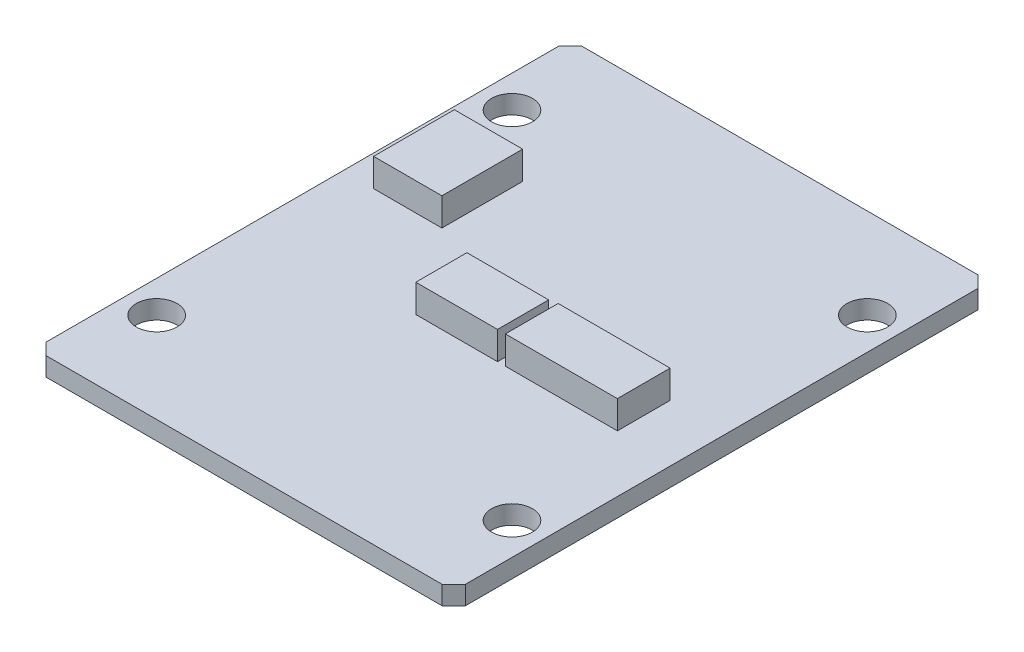
ISO-10303-21;
HEADER;
FILE_DESCRIPTION(('STEP AP214'),'2;1');
FILE_NAME('part.step','',(''),(''),'','','');
FILE_SCHEMA(('AUTOMOTIVE_DESIGN { 1 0 10303 214 1 1 1 1 }'));
ENDSEC;
DATA;
#1=APPLICATION_CONTEXT('core data for automotive mechanical design processes');
#2=APPLICATION_PROTOCOL_DEFINITION('international standard','automotive_design',2000,#1);
#3=PRODUCT_CONTEXT('',#1,'mechanical');
#4=PRODUCT('Part','Part','',(#3));
#5=PRODUCT_RELATED_PRODUCT_CATEGORY('part','',(#4));
#6=PRODUCT_DEFINITION_FORMATION('','',#4);
#7=PRODUCT_DEFINITION_CONTEXT('part definition',#1,'design');
#8=PRODUCT_DEFINITION('design','',#6,#7);
#9=PRODUCT_DEFINITION_SHAPE('','',#8);
#10=(LENGTH_UNIT() NAMED_UNIT(*) SI_UNIT(.MILLI.,.METRE.));
#11=(NAMED_UNIT(*) PLANE_ANGLE_UNIT() SI_UNIT($,.RADIAN.));
#12=(NAMED_UNIT(*) SI_UNIT($,.STERADIAN.) SOLID_ANGLE_UNIT());
#13=UNCERTAINTY_MEASURE_WITH_UNIT(LENGTH_MEASURE(1.E-05),#10,'distance_accuracy_value','');
#14=(GEOMETRIC_REPRESENTATION_CONTEXT(3) GLOBAL_UNCERTAINTY_ASSIGNED_CONTEXT((#13)) GLOBAL_UNIT_ASSIGNED_CONTEXT((#10,
#11,#12)) REPRESENTATION_CONTEXT('',''));
#15=CARTESIAN_POINT('',(0.,0.,0.));
#16=DIRECTION('',(0.,0.,1.));
#17=DIRECTION('',(1.,0.,0.));
#18=AXIS2_PLACEMENT_3D('',#15,#16,#17);
#19=CARTESIAN_POINT('',(-18.,1.6,0.));
#20=DIRECTION('',(1.,0.,0.));
#21=DIRECTION('',(0.,0.,-1.));
#22=AXIS2_PLACEMENT_3D('',#19,#20,#21);
#23=PLANE('',#22);
#24=DIRECTION('',(0.,0.,1.));
#25=VECTOR('',#24,1.);
#26=CARTESIAN_POINT('',(-18.,0.,0.));
#27=LINE('',#26,#25);
#28=CARTESIAN_POINT('',(-18.,0.,-22.));
#29=VERTEX_POINT('',#28);
#30=CARTESIAN_POINT('',(-18.,0.,22.));
#31=VERTEX_POINT('',#30);
#32=EDGE_CURVE('E270',#29,#31,#27,.T.);
#33=ORIENTED_EDGE('',*,*,#32,.T.);
#34=DIRECTION('',(0.,1.,0.));
#35=VECTOR('',#34,1.);
#36=CARTESIAN_POINT('',(-18.,1.6,22.));
#37=LINE('',#36,#35);
#38=CARTESIAN_POINT('',(-18.,1.6,22.));
#39=VERTEX_POINT('',#38);
#40=EDGE_CURVE('E350',#31,#39,#37,.T.);
#41=ORIENTED_EDGE('',*,*,#40,.T.);
#42=DIRECTION('',(0.,0.,1.));
#43=VECTOR('',#42,1.);
#44=CARTESIAN_POINT('',(-18.,1.6,0.));
#45=LINE('',#44,#43);
#46=CARTESIAN_POINT('',(-18.,1.6,-22.));
#47=VERTEX_POINT('',#46);
#48=EDGE_CURVE('E276',#47,#39,#45,.T.);
#49=ORIENTED_EDGE('',*,*,#48,.F.);
#50=DIRECTION('',(0.,-1.,0.));
#51=VECTOR('',#50,1.);
#52=CARTESIAN_POINT('',(-18.,0.,-22.));
#53=LINE('',#52,#51);
#54=EDGE_CURVE('E347',#47,#29,#53,.T.);
#55=ORIENTED_EDGE('',*,*,#54,.T.);
#56=EDGE_LOOP('',(#33,#41,#49,#55));
#57=FACE_BOUND('',#56,.T.);
#58=ADVANCED_FACE('F38',(#57),#23,.F.);
#59=CARTESIAN_POINT('',(0.,1.6,23.));
#60=DIRECTION('',(0.,0.,-1.));
#61=DIRECTION('',(-1.,0.,0.));
#62=AXIS2_PLACEMENT_3D('',#59,#60,#61);
#63=PLANE('',#62);
#64=DIRECTION('',(1.,0.,0.));
#65=VECTOR('',#64,1.);
#66=CARTESIAN_POINT('',(0.,0.,23.));
#67=LINE('',#66,#65);
#68=CARTESIAN_POINT('',(-17.,0.,23.));
#69=VERTEX_POINT('',#68);
#70=CARTESIAN_POINT('',(17.,0.,23.));
#71=VERTEX_POINT('',#70);
#72=EDGE_CURVE('E303',#69,#71,#67,.T.);
#73=ORIENTED_EDGE('',*,*,#72,.T.);
#74=DIRECTION('',(0.,1.,0.));
#75=VECTOR('',#74,1.);
#76=CARTESIAN_POINT('',(17.,1.6,23.));
#77=LINE('',#76,#75);
#78=CARTESIAN_POINT('',(17.,1.6,23.));
#79=VERTEX_POINT('',#78);
#80=EDGE_CURVE('E338',#71,#79,#77,.T.);
#81=ORIENTED_EDGE('',*,*,#80,.T.);
#82=DIRECTION('',(1.,0.,0.));
#83=VECTOR('',#82,1.);
#84=CARTESIAN_POINT('',(0.,1.6,23.));
#85=LINE('',#84,#83);
#86=CARTESIAN_POINT('',(-17.,1.6,23.));
#87=VERTEX_POINT('',#86);
#88=EDGE_CURVE('E279',#87,#79,#85,.T.);
#89=ORIENTED_EDGE('',*,*,#88,.F.);
#90=DIRECTION('',(0.,-1.,0.));
#91=VECTOR('',#90,1.);
#92=CARTESIAN_POINT('',(-17.,1.6,23.));
#93=LINE('',#92,#91);
#94=EDGE_CURVE('E335',#87,#69,#93,.T.);
#95=ORIENTED_EDGE('',*,*,#94,.T.);
#96=EDGE_LOOP('',(#73,#81,#89,#95));
#97=FACE_BOUND('',#96,.T.);
#98=ADVANCED_FACE('F376',(#97),#63,.F.);
#99=CARTESIAN_POINT('',(18.,1.6,0.));
#100=DIRECTION('',(1.,0.,0.));
#101=DIRECTION('',(0.,0.,-1.));
#102=AXIS2_PLACEMENT_3D('',#99,#100,#101);
#103=PLANE('',#102);
#104=DIRECTION('',(0.,0.,1.));
#105=VECTOR('',#104,1.);
#106=CARTESIAN_POINT('',(18.,1.6,0.));
#107=LINE('',#106,#105);
#108=CARTESIAN_POINT('',(18.,1.6,-22.));
#109=VERTEX_POINT('',#108);
#110=CARTESIAN_POINT('',(18.,1.6,22.));
#111=VERTEX_POINT('',#110);
#112=EDGE_CURVE('E283',#109,#111,#107,.T.);
#113=ORIENTED_EDGE('',*,*,#112,.T.);
#114=DIRECTION('',(0.,-1.,0.));
#115=VECTOR('',#114,1.);
#116=CARTESIAN_POINT('',(18.,0.,22.));
#117=LINE('',#116,#115);
#118=CARTESIAN_POINT('',(18.,0.,22.));
#119=VERTEX_POINT('',#118);
#120=EDGE_CURVE('E324',#111,#119,#117,.T.);
#121=ORIENTED_EDGE('',*,*,#120,.T.);
#122=DIRECTION('',(0.,0.,1.));
#123=VECTOR('',#122,1.);
#124=CARTESIAN_POINT('',(18.,0.,0.));
#125=LINE('',#124,#123);
#126=CARTESIAN_POINT('',(18.,0.,-22.));
#127=VERTEX_POINT('',#126);
#128=EDGE_CURVE('E306',#127,#119,#125,.T.);
#129=ORIENTED_EDGE('',*,*,#128,.F.);
#130=DIRECTION('',(0.,1.,0.));
#131=VECTOR('',#130,1.);
#132=CARTESIAN_POINT('',(18.,1.6,-22.));
#133=LINE('',#132,#131);
#134=EDGE_CURVE('E300',#127,#109,#133,.T.);
#135=ORIENTED_EDGE('',*,*,#134,.T.);
#136=EDGE_LOOP('',(#113,#121,#129,#135));
#137=FACE_BOUND('',#136,.T.);
#138=ADVANCED_FACE('F383',(#137),#103,.T.);
#139=CARTESIAN_POINT('',(-15.25,1.6,-15.25));
#140=DIRECTION('',(0.,-1.,0.));
#141=DIRECTION('',(0.,0.,-1.));
#142=AXIS2_PLACEMENT_3D('',#139,#140,#141);
#143=CYLINDRICAL_SURFACE('',#142,1.75);
#144=CARTESIAN_POINT('',(-15.25,1.6,-15.25));
#145=DIRECTION('',(0.,1.,0.));
#146=DIRECTION('',(0.,0.,1.));
#147=AXIS2_PLACEMENT_3D('',#144,#145,#146);
#148=CIRCLE('',#147,1.75);
#149=CARTESIAN_POINT('',(-15.25,1.6,-13.5));
#150=VERTEX_POINT('',#149);
#151=EDGE_CURVE('E294',#150,#150,#148,.T.);
#152=ORIENTED_EDGE('',*,*,#151,.T.);
#153=EDGE_LOOP('',(#152));
#154=FACE_BOUND('',#153,.T.);
#155=CARTESIAN_POINT('',(-15.25,0.,-15.25));
#156=DIRECTION('',(0.,1.,0.));
#157=DIRECTION('',(0.,0.,1.));
#158=AXIS2_PLACEMENT_3D('',#155,#156,#157);
#159=CIRCLE('',#158,1.75);
#160=CARTESIAN_POINT('',(-15.25,0.,-13.5));
#161=VERTEX_POINT('',#160);
#162=EDGE_CURVE('E318',#161,#161,#159,.T.);
#163=ORIENTED_EDGE('',*,*,#162,.F.);
#164=EDGE_LOOP('',(#163));
#165=FACE_BOUND('',#164,.T.);
#166=ADVANCED_FACE('F595',(#154,#165),#143,.F.);
#167=CARTESIAN_POINT('',(15.25,1.6,-15.25));
#168=DIRECTION('',(0.,-1.,0.));
#169=DIRECTION('',(0.,0.,-1.));
#170=AXIS2_PLACEMENT_3D('',#167,#168,#169);
#171=CYLINDRICAL_SURFACE('',#170,1.75);
#172=CARTESIAN_POINT('',(15.25,1.6,-15.25));
#173=DIRECTION('',(0.,1.,0.));
#174=DIRECTION('',(0.,0.,1.));
#175=AXIS2_PLACEMENT_3D('',#172,#173,#174);
#176=CIRCLE('',#175,1.75);
#177=CARTESIAN_POINT('',(15.25,1.6,-13.5));
#178=VERTEX_POINT('',#177);
#179=EDGE_CURVE('E291',#178,#178,#176,.F.);
#180=ORIENTED_EDGE('',*,*,#179,.F.);
#181=EDGE_LOOP('',(#180));
#182=FACE_BOUND('',#181,.T.);
#183=CARTESIAN_POINT('',(15.25,0.,-15.25));
#184=DIRECTION('',(0.,1.,0.));
#185=DIRECTION('',(0.,0.,1.));
#186=AXIS2_PLACEMENT_3D('',#183,#184,#185);
#187=CIRCLE('',#186,1.75);
#188=CARTESIAN_POINT('',(15.25,0.,-13.5));
#189=VERTEX_POINT('',#188);
#190=EDGE_CURVE('E315',#189,#189,#187,.F.);
#191=ORIENTED_EDGE('',*,*,#190,.T.);
#192=EDGE_LOOP('',(#191));
#193=FACE_BOUND('',#192,.T.);
#194=ADVANCED_FACE('F619',(#182,#193),#171,.F.);
#195=CARTESIAN_POINT('',(15.25,1.6,15.25));
#196=DIRECTION('',(0.,-1.,0.));
#197=DIRECTION('',(0.,0.,-1.));
#198=AXIS2_PLACEMENT_3D('',#195,#196,#197);
#199=CYLINDRICAL_SURFACE('',#198,1.75);
#200=CARTESIAN_POINT('',(15.25,1.6,15.25));
#201=DIRECTION('',(0.,1.,0.));
#202=DIRECTION('',(0.,0.,1.));
#203=AXIS2_PLACEMENT_3D('',#200,#201,#202);
#204=CIRCLE('',#203,1.75);
#205=CARTESIAN_POINT('',(15.25,1.6,17.));
#206=VERTEX_POINT('',#205);
#207=EDGE_CURVE('E288',#206,#206,#204,.T.);
#208=ORIENTED_EDGE('',*,*,#207,.T.);
#209=EDGE_LOOP('',(#208));
#210=FACE_BOUND('',#209,.T.);
#211=CARTESIAN_POINT('',(15.25,0.,15.25));
#212=DIRECTION('',(0.,1.,0.));
#213=DIRECTION('',(0.,0.,1.));
#214=AXIS2_PLACEMENT_3D('',#211,#212,#213);
#215=CIRCLE('',#214,1.75);
#216=CARTESIAN_POINT('',(15.25,0.,17.));
#217=VERTEX_POINT('',#216);
#218=EDGE_CURVE('E312',#217,#217,#215,.T.);
#219=ORIENTED_EDGE('',*,*,#218,.F.);
#220=EDGE_LOOP('',(#219));
#221=FACE_BOUND('',#220,.T.);
#222=ADVANCED_FACE('F582',(#210,#221),#199,.F.);
#223=CARTESIAN_POINT('',(0.,1.6,-23.));
#224=DIRECTION('',(0.,0.,-1.));
#225=DIRECTION('',(-1.,0.,0.));
#226=AXIS2_PLACEMENT_3D('',#223,#224,#225);
#227=PLANE('',#226);
#228=DIRECTION('',(1.,0.,0.));
#229=VECTOR('',#228,1.);
#230=CARTESIAN_POINT('',(0.,0.,-23.));
#231=LINE('',#230,#229);
#232=CARTESIAN_POINT('',(-17.,0.,-23.));
#233=VERTEX_POINT('',#232);
#234=CARTESIAN_POINT('',(17.,0.,-23.));
#235=VERTEX_POINT('',#234);
#236=EDGE_CURVE('E309',#233,#235,#231,.T.);
#237=ORIENTED_EDGE('',*,*,#236,.F.);
#238=DIRECTION('',(0.,1.,0.));
#239=VECTOR('',#238,1.);
#240=CARTESIAN_POINT('',(-17.,1.6,-23.));
#241=LINE('',#240,#239);
#242=CARTESIAN_POINT('',(-17.,1.6,-23.));
#243=VERTEX_POINT('',#242);
#244=EDGE_CURVE('E12',#233,#243,#241,.T.);
#245=ORIENTED_EDGE('',*,*,#244,.T.);
#246=DIRECTION('',(1.,0.,0.));
#247=VECTOR('',#246,1.);
#248=CARTESIAN_POINT('',(0.,1.6,-23.));
#249=LINE('',#248,#247);
#250=CARTESIAN_POINT('',(17.,1.6,-23.));
#251=VERTEX_POINT('',#250);
#252=EDGE_CURVE('E286',#243,#251,#249,.T.);
#253=ORIENTED_EDGE('',*,*,#252,.T.);
#254=DIRECTION('',(0.,-1.,0.));
#255=VECTOR('',#254,1.);
#256=CARTESIAN_POINT('',(17.,1.6,-23.));
#257=LINE('',#256,#255);
#258=EDGE_CURVE('E46',#251,#235,#257,.T.);
#259=ORIENTED_EDGE('',*,*,#258,.T.);
#260=EDGE_LOOP('',(#237,#245,#253,#259));
#261=FACE_BOUND('',#260,.T.);
#262=ADVANCED_FACE('F353',(#261),#227,.T.);
#263=CARTESIAN_POINT('',(-15.25,1.6,15.25));
#264=DIRECTION('',(0.,-1.,0.));
#265=DIRECTION('',(0.,0.,-1.));
#266=AXIS2_PLACEMENT_3D('',#263,#264,#265);
#267=CYLINDRICAL_SURFACE('',#266,1.75);
#268=CARTESIAN_POINT('',(-15.25,1.6,15.25));
#269=DIRECTION('',(0.,1.,0.));
#270=DIRECTION('',(0.,0.,1.));
#271=AXIS2_PLACEMENT_3D('',#268,#269,#270);
#272=CIRCLE('',#271,1.75);
#273=CARTESIAN_POINT('',(-15.25,1.6,17.));
#274=VERTEX_POINT('',#273);
#275=EDGE_CURVE('E297',#274,#274,#272,.F.);
#276=ORIENTED_EDGE('',*,*,#275,.F.);
#277=EDGE_LOOP('',(#276));
#278=FACE_BOUND('',#277,.T.);
#279=CARTESIAN_POINT('',(-15.25,0.,15.25));
#280=DIRECTION('',(0.,1.,0.));
#281=DIRECTION('',(0.,0.,1.));
#282=AXIS2_PLACEMENT_3D('',#279,#280,#281);
#283=CIRCLE('',#282,1.75);
#284=CARTESIAN_POINT('',(-15.25,0.,17.));
#285=VERTEX_POINT('',#284);
#286=EDGE_CURVE('E280',#285,#285,#283,.F.);
#287=ORIENTED_EDGE('',*,*,#286,.T.);
#288=EDGE_LOOP('',(#287));
#289=FACE_BOUND('',#288,.T.);
#290=ADVANCED_FACE('F571',(#278,#289),#267,.F.);
#291=CARTESIAN_POINT('',(0.,1.6,0.));
#292=DIRECTION('',(0.,1.,0.));
#293=DIRECTION('',(0.,0.,1.));
#294=AXIS2_PLACEMENT_3D('',#291,#292,#293);
#295=PLANE('',#294);
#296=DIRECTION('',(0.,0.,1.));
#297=VECTOR('',#296,1.);
#298=CARTESIAN_POINT('',(13.1179567969752,1.6,0.));
#299=LINE('',#298,#297);
#300=CARTESIAN_POINT('',(13.1179567969752,1.6,-0.456616261899967));
#301=VERTEX_POINT('',#300);
#302=CARTESIAN_POINT('',(13.1179567969752,1.6,4.07409624601484));
#303=VERTEX_POINT('',#302);
#304=EDGE_CURVE('E199',#301,#303,#299,.T.);
#305=ORIENTED_EDGE('',*,*,#304,.T.);
#306=DIRECTION('',(-1.,0.,0.));
#307=VECTOR('',#306,1.);
#308=CARTESIAN_POINT('',(0.,1.6,4.07409624601485));
#309=LINE('',#308,#307);
#310=CARTESIAN_POINT('',(3.50408128491608,1.6,4.07409624601485));
#311=VERTEX_POINT('',#310);
#312=EDGE_CURVE('E190',#303,#311,#309,.T.);
#313=ORIENTED_EDGE('',*,*,#312,.T.);
#314=DIRECTION('',(0.,0.,1.));
#315=VECTOR('',#314,1.);
#316=CARTESIAN_POINT('',(3.50408128491608,1.6,0.));
#317=LINE('',#316,#315);
#318=CARTESIAN_POINT('',(3.50408128491608,1.6,-0.456616261899966));
#319=VERTEX_POINT('',#318);
#320=EDGE_CURVE('E210',#319,#311,#317,.T.);
#321=ORIENTED_EDGE('',*,*,#320,.F.);
#322=DIRECTION('',(-1.,0.,0.));
#323=VECTOR('',#322,1.);
#324=CARTESIAN_POINT('',(0.,1.6,-0.456616261899965));
#325=LINE('',#324,#323);
#326=EDGE_CURVE('E203',#301,#319,#325,.T.);
#327=ORIENTED_EDGE('',*,*,#326,.F.);
#328=EDGE_LOOP('',(#305,#313,#321,#327));
#329=FACE_BOUND('',#328,.T.);
#330=DIRECTION('',(0.,0.,1.));
#331=VECTOR('',#330,1.);
#332=CARTESIAN_POINT('',(2.83132891269133,1.6,0.));
#333=LINE('',#332,#331);
#334=CARTESIAN_POINT('',(2.83132891269133,1.6,-0.315445177790253));
#335=VERTEX_POINT('',#334);
#336=CARTESIAN_POINT('',(2.83132891269133,1.6,4.07409624601485));
#337=VERTEX_POINT('',#336);
#338=EDGE_CURVE('E213',#335,#337,#333,.T.);
#339=ORIENTED_EDGE('',*,*,#338,.T.);
#340=DIRECTION('',(-1.,0.,0.));
#341=VECTOR('',#340,1.);
#342=CARTESIAN_POINT('',(0.,1.6,4.07409624601485));
#343=LINE('',#342,#341);
#344=CARTESIAN_POINT('',(-4.18474470458818,1.6,4.07409624601485));
#345=VERTEX_POINT('',#344);
#346=EDGE_CURVE('E216',#337,#345,#343,.T.);
#347=ORIENTED_EDGE('',*,*,#346,.T.);
#348=DIRECTION('',(0.,0.,1.));
#349=VECTOR('',#348,1.);
#350=CARTESIAN_POINT('',(-4.18474470458818,1.6,0.));
#351=LINE('',#350,#349);
#352=CARTESIAN_POINT('',(-4.18474470458818,1.6,-0.315445177790252));
#353=VERTEX_POINT('',#352);
#354=EDGE_CURVE('E221',#353,#345,#351,.T.);
#355=ORIENTED_EDGE('',*,*,#354,.F.);
#356=DIRECTION('',(-1.,0.,0.));
#357=VECTOR('',#356,1.);
#358=CARTESIAN_POINT('',(0.,1.6,-0.315445177790253));
#359=LINE('',#358,#357);
#360=EDGE_CURVE('E226',#335,#353,#359,.T.);
#361=ORIENTED_EDGE('',*,*,#360,.F.);
#362=EDGE_LOOP('',(#339,#347,#355,#361));
#363=FACE_BOUND('',#362,.T.);
#364=DIRECTION('',(0.,0.,1.));
#365=VECTOR('',#364,1.);
#366=CARTESIAN_POINT('',(-9.49091762336707,1.6,0.));
#367=LINE('',#366,#365);
#368=CARTESIAN_POINT('',(-9.49091762336707,1.6,-10.4053504783934));
#369=VERTEX_POINT('',#368);
#370=CARTESIAN_POINT('',(-9.49091762336707,1.6,-3.47196775484804));
#371=VERTEX_POINT('',#370);
#372=EDGE_CURVE('E248',#369,#371,#367,.T.);
#373=ORIENTED_EDGE('',*,*,#372,.T.);
#374=DIRECTION('',(1.,0.,0.));
#375=VECTOR('',#374,1.);
#376=CARTESIAN_POINT('',(0.,1.6,-3.47196775484804));
#377=LINE('',#376,#375);
#378=CARTESIAN_POINT('',(-15.35478813841,1.6,-3.47196775484804));
#379=VERTEX_POINT('',#378);
#380=EDGE_CURVE('E245',#379,#371,#377,.T.);
#381=ORIENTED_EDGE('',*,*,#380,.F.);
#382=DIRECTION('',(0.,0.,1.));
#383=VECTOR('',#382,1.);
#384=CARTESIAN_POINT('',(-15.35478813841,1.6,0.));
#385=LINE('',#384,#383);
#386=CARTESIAN_POINT('',(-15.35478813841,1.6,-10.4053504783934));
#387=VERTEX_POINT('',#386);
#388=EDGE_CURVE('E250',#387,#379,#385,.T.);
#389=ORIENTED_EDGE('',*,*,#388,.F.);
#390=DIRECTION('',(1.,0.,0.));
#391=VECTOR('',#390,1.);
#392=CARTESIAN_POINT('',(0.,1.6,-10.4053504783934));
#393=LINE('',#392,#391);
#394=EDGE_CURVE('E253',#387,#369,#393,.T.);
#395=ORIENTED_EDGE('',*,*,#394,.T.);
#396=EDGE_LOOP('',(#373,#381,#389,#395));
#397=FACE_BOUND('',#396,.T.);
#398=ORIENTED_EDGE('',*,*,#88,.T.);
#399=DIRECTION('',(0.70710678118655,0.,-0.707106781186545));
#400=VECTOR('',#399,1.);
#401=CARTESIAN_POINT('',(19.9999999999999,1.6,20.0000000000001));
#402=LINE('',#401,#400);
#403=EDGE_CURVE('E345',#79,#111,#402,.T.);
#404=ORIENTED_EDGE('',*,*,#403,.T.);
#405=ORIENTED_EDGE('',*,*,#112,.F.);
#406=DIRECTION('',(0.707106781186545,0.,0.70710678118655));
#407=VECTOR('',#406,1.);
#408=CARTESIAN_POINT('',(20.0000000000001,1.6,-19.9999999999999));
#409=LINE('',#408,#407);
#410=EDGE_CURVE('E53',#109,#251,#409,.F.);
#411=ORIENTED_EDGE('',*,*,#410,.T.);
#412=ORIENTED_EDGE('',*,*,#252,.F.);
#413=DIRECTION('',(-0.70710678118655,0.,0.707106781186545));
#414=VECTOR('',#413,1.);
#415=CARTESIAN_POINT('',(-19.9999999999999,1.6,-20.0000000000001));
#416=LINE('',#415,#414);
#417=EDGE_CURVE('E341',#243,#47,#416,.T.);
#418=ORIENTED_EDGE('',*,*,#417,.T.);
#419=ORIENTED_EDGE('',*,*,#48,.T.);
#420=DIRECTION('',(-0.707106781186545,0.,-0.70710678118655));
#421=VECTOR('',#420,1.);
#422=CARTESIAN_POINT('',(-20.0000000000001,1.6,19.9999999999999));
#423=LINE('',#422,#421);
#424=EDGE_CURVE('E343',#39,#87,#423,.F.);
#425=ORIENTED_EDGE('',*,*,#424,.T.);
#426=EDGE_LOOP('',(#398,#404,#405,#411,#412,#418,#419,#425));
#427=FACE_BOUND('',#426,.T.);
#428=ORIENTED_EDGE('',*,*,#207,.F.);
#429=EDGE_LOOP('',(#428));
#430=FACE_BOUND('',#429,.T.);
#431=ORIENTED_EDGE('',*,*,#179,.T.);
#432=EDGE_LOOP('',(#431));
#433=FACE_BOUND('',#432,.T.);
#434=ORIENTED_EDGE('',*,*,#151,.F.);
#435=EDGE_LOOP('',(#434));
#436=FACE_BOUND('',#435,.T.);
#437=ORIENTED_EDGE('',*,*,#275,.T.);
#438=EDGE_LOOP('',(#437));
#439=FACE_BOUND('',#438,.T.);
#440=ADVANCED_FACE('F368',(#329,#363,#397,#427,#430,#433,#436,#439),#295,.T.);
#441=CARTESIAN_POINT('',(0.,0.,0.));
#442=DIRECTION('',(0.,1.,0.));
#443=DIRECTION('',(0.,0.,1.));
#444=AXIS2_PLACEMENT_3D('',#441,#442,#443);
#445=PLANE('',#444);
#446=ORIENTED_EDGE('',*,*,#128,.T.);
#447=DIRECTION('',(-0.70710678118655,0.,0.707106781186545));
#448=VECTOR('',#447,1.);
#449=CARTESIAN_POINT('',(18.,0.,22.));
#450=LINE('',#449,#448);
#451=EDGE_CURVE('E333',#119,#71,#450,.T.);
#452=ORIENTED_EDGE('',*,*,#451,.T.);
#453=ORIENTED_EDGE('',*,*,#72,.F.);
#454=DIRECTION('',(0.707106781186545,0.,0.70710678118655));
#455=VECTOR('',#454,1.);
#456=CARTESIAN_POINT('',(-17.,0.,23.));
#457=LINE('',#456,#455);
#458=EDGE_CURVE('E331',#69,#31,#457,.F.);
#459=ORIENTED_EDGE('',*,*,#458,.T.);
#460=ORIENTED_EDGE('',*,*,#32,.F.);
#461=DIRECTION('',(0.70710678118655,0.,-0.707106781186545));
#462=VECTOR('',#461,1.);
#463=CARTESIAN_POINT('',(-18.,0.,-22.));
#464=LINE('',#463,#462);
#465=EDGE_CURVE('E329',#29,#233,#464,.T.);
#466=ORIENTED_EDGE('',*,*,#465,.T.);
#467=ORIENTED_EDGE('',*,*,#236,.T.);
#468=DIRECTION('',(-0.707106781186545,0.,-0.70710678118655));
#469=VECTOR('',#468,1.);
#470=CARTESIAN_POINT('',(17.,0.,-23.));
#471=LINE('',#470,#469);
#472=EDGE_CURVE('E327',#235,#127,#471,.F.);
#473=ORIENTED_EDGE('',*,*,#472,.T.);
#474=EDGE_LOOP('',(#446,#452,#453,#459,#460,#466,#467,#473));
#475=FACE_BOUND('',#474,.T.);
#476=ORIENTED_EDGE('',*,*,#218,.T.);
#477=EDGE_LOOP('',(#476));
#478=FACE_BOUND('',#477,.T.);
#479=ORIENTED_EDGE('',*,*,#190,.F.);
#480=EDGE_LOOP('',(#479));
#481=FACE_BOUND('',#480,.T.);
#482=ORIENTED_EDGE('',*,*,#162,.T.);
#483=EDGE_LOOP('',(#482));
#484=FACE_BOUND('',#483,.T.);
#485=ORIENTED_EDGE('',*,*,#286,.F.);
#486=EDGE_LOOP('',(#485));
#487=FACE_BOUND('',#486,.T.);
#488=ADVANCED_FACE('F356',(#475,#478,#481,#484,#487),#445,.F.);
#489=CARTESIAN_POINT('',(-9.49091762336707,18.6279799675548,0.));
#490=DIRECTION('',(1.,0.,0.));
#491=DIRECTION('',(0.,0.,-1.));
#492=AXIS2_PLACEMENT_3D('',#489,#490,#491);
#493=PLANE('',#492);
#494=DIRECTION('',(0.,-1.,0.));
#495=VECTOR('',#494,1.);
#496=CARTESIAN_POINT('',(-9.49091762336707,18.6279799675548,-10.4053504783934));
#497=LINE('',#496,#495);
#498=CARTESIAN_POINT('',(-9.49091762336707,4.,-10.4053504783934));
#499=VERTEX_POINT('',#498);
#500=EDGE_CURVE('E264',#499,#369,#497,.T.);
#501=ORIENTED_EDGE('',*,*,#500,.F.);
#502=DIRECTION('',(0.,0.,1.));
#503=VECTOR('',#502,1.);
#504=CARTESIAN_POINT('',(-9.49091762336707,4.,0.));
#505=LINE('',#504,#503);
#506=CARTESIAN_POINT('',(-9.49091762336707,4.,-3.47196775484804));
#507=VERTEX_POINT('',#506);
#508=EDGE_CURVE('E229',#499,#507,#505,.T.);
#509=ORIENTED_EDGE('',*,*,#508,.T.);
#510=DIRECTION('',(0.,-1.,0.));
#511=VECTOR('',#510,1.);
#512=CARTESIAN_POINT('',(-9.49091762336707,18.6279799675548,-3.47196775484804));
#513=LINE('',#512,#511);
#514=EDGE_CURVE('E265',#507,#371,#513,.T.);
#515=ORIENTED_EDGE('',*,*,#514,.T.);
#516=ORIENTED_EDGE('',*,*,#372,.F.);
#517=EDGE_LOOP('',(#501,#509,#515,#516));
#518=FACE_BOUND('',#517,.T.);
#519=ADVANCED_FACE('F541',(#518),#493,.T.);
#520=CARTESIAN_POINT('',(0.,18.6279799675548,-10.4053504783934));
#521=DIRECTION('',(0.,0.,-1.));
#522=DIRECTION('',(-1.,0.,0.));
#523=AXIS2_PLACEMENT_3D('',#520,#521,#522);
#524=PLANE('',#523);
#525=DIRECTION('',(0.,-1.,0.));
#526=VECTOR('',#525,1.);
#527=CARTESIAN_POINT('',(-15.35478813841,18.6279799675548,-10.4053504783934));
#528=LINE('',#527,#526);
#529=CARTESIAN_POINT('',(-15.35478813841,4.,-10.4053504783934));
#530=VERTEX_POINT('',#529);
#531=EDGE_CURVE('E252',#530,#387,#528,.T.);
#532=ORIENTED_EDGE('',*,*,#531,.F.);
#533=DIRECTION('',(1.,0.,0.));
#534=VECTOR('',#533,1.);
#535=CARTESIAN_POINT('',(0.,4.,-10.4053504783934));
#536=LINE('',#535,#534);
#537=EDGE_CURVE('E262',#530,#499,#536,.T.);
#538=ORIENTED_EDGE('',*,*,#537,.T.);
#539=ORIENTED_EDGE('',*,*,#500,.T.);
#540=ORIENTED_EDGE('',*,*,#394,.F.);
#541=EDGE_LOOP('',(#532,#538,#539,#540));
#542=FACE_BOUND('',#541,.T.);
#543=ADVANCED_FACE('F532',(#542),#524,.T.);
#544=CARTESIAN_POINT('',(-15.35478813841,18.6279799675548,0.));
#545=DIRECTION('',(1.,0.,0.));
#546=DIRECTION('',(0.,0.,-1.));
#547=AXIS2_PLACEMENT_3D('',#544,#545,#546);
#548=PLANE('',#547);
#549=DIRECTION('',(0.,0.,1.));
#550=VECTOR('',#549,1.);
#551=CARTESIAN_POINT('',(-15.35478813841,4.,0.));
#552=LINE('',#551,#550);
#553=CARTESIAN_POINT('',(-15.35478813841,4.,-3.47196775484804));
#554=VERTEX_POINT('',#553);
#555=EDGE_CURVE('E256',#530,#554,#552,.T.);
#556=ORIENTED_EDGE('',*,*,#555,.F.);
#557=ORIENTED_EDGE('',*,*,#531,.T.);
#558=ORIENTED_EDGE('',*,*,#388,.T.);
#559=DIRECTION('',(0.,-1.,0.));
#560=VECTOR('',#559,1.);
#561=CARTESIAN_POINT('',(-15.35478813841,18.6279799675548,-3.47196775484804));
#562=LINE('',#561,#560);
#563=EDGE_CURVE('E249',#554,#379,#562,.T.);
#564=ORIENTED_EDGE('',*,*,#563,.F.);
#565=EDGE_LOOP('',(#556,#557,#558,#564));
#566=FACE_BOUND('',#565,.T.);
#567=ADVANCED_FACE('F523',(#566),#548,.F.);
#568=CARTESIAN_POINT('',(0.,18.6279799675548,-3.47196775484804));
#569=DIRECTION('',(0.,0.,-1.));
#570=DIRECTION('',(-1.,0.,0.));
#571=AXIS2_PLACEMENT_3D('',#568,#569,#570);
#572=PLANE('',#571);
#573=DIRECTION('',(1.,0.,0.));
#574=VECTOR('',#573,1.);
#575=CARTESIAN_POINT('',(0.,4.,-3.47196775484804));
#576=LINE('',#575,#574);
#577=EDGE_CURVE('E261',#554,#507,#576,.T.);
#578=ORIENTED_EDGE('',*,*,#577,.F.);
#579=ORIENTED_EDGE('',*,*,#563,.T.);
#580=ORIENTED_EDGE('',*,*,#380,.T.);
#581=ORIENTED_EDGE('',*,*,#514,.F.);
#582=EDGE_LOOP('',(#578,#579,#580,#581));
#583=FACE_BOUND('',#582,.T.);
#584=ADVANCED_FACE('F514',(#583),#572,.F.);
#585=CARTESIAN_POINT('',(0.,4.,0.));
#586=DIRECTION('',(0.,1.,0.));
#587=DIRECTION('',(0.,0.,1.));
#588=AXIS2_PLACEMENT_3D('',#585,#586,#587);
#589=PLANE('',#588);
#590=ORIENTED_EDGE('',*,*,#508,.F.);
#591=ORIENTED_EDGE('',*,*,#537,.F.);
#592=ORIENTED_EDGE('',*,*,#555,.T.);
#593=ORIENTED_EDGE('',*,*,#577,.T.);
#594=EDGE_LOOP('',(#590,#591,#592,#593));
#595=FACE_BOUND('',#594,.T.);
#596=ADVANCED_FACE('F505',(#595),#589,.T.);
#597=CARTESIAN_POINT('',(0.,4.,0.));
#598=DIRECTION('',(0.,1.,0.));
#599=DIRECTION('',(0.,0.,1.));
#600=AXIS2_PLACEMENT_3D('',#597,#598,#599);
#601=PLANE('',#600);
#602=DIRECTION('',(0.,0.,1.));
#603=VECTOR('',#602,1.);
#604=CARTESIAN_POINT('',(2.83132891269133,4.,0.));
#605=LINE('',#604,#603);
#606=CARTESIAN_POINT('',(2.83132891269133,4.,-0.315445177790253));
#607=VERTEX_POINT('',#606);
#608=CARTESIAN_POINT('',(2.83132891269133,4.,4.07409624601485));
#609=VERTEX_POINT('',#608);
#610=EDGE_CURVE('E220',#607,#609,#605,.T.);
#611=ORIENTED_EDGE('',*,*,#610,.F.);
#612=DIRECTION('',(-1.,0.,0.));
#613=VECTOR('',#612,1.);
#614=CARTESIAN_POINT('',(0.,4.,-0.315445177790253));
#615=LINE('',#614,#613);
#616=CARTESIAN_POINT('',(-4.18474470458818,4.,-0.315445177790252));
#617=VERTEX_POINT('',#616);
#618=EDGE_CURVE('E233',#607,#617,#615,.T.);
#619=ORIENTED_EDGE('',*,*,#618,.T.);
#620=DIRECTION('',(0.,0.,1.));
#621=VECTOR('',#620,1.);
#622=CARTESIAN_POINT('',(-4.18474470458818,4.,0.));
#623=LINE('',#622,#621);
#624=CARTESIAN_POINT('',(-4.18474470458818,4.,4.07409624601485));
#625=VERTEX_POINT('',#624);
#626=EDGE_CURVE('E217',#617,#625,#623,.T.);
#627=ORIENTED_EDGE('',*,*,#626,.T.);
#628=DIRECTION('',(-1.,0.,0.));
#629=VECTOR('',#628,1.);
#630=CARTESIAN_POINT('',(0.,4.,4.07409624601485));
#631=LINE('',#630,#629);
#632=EDGE_CURVE('E236',#609,#625,#631,.T.);
#633=ORIENTED_EDGE('',*,*,#632,.F.);
#634=EDGE_LOOP('',(#611,#619,#627,#633));
#635=FACE_BOUND('',#634,.T.);
#636=ADVANCED_FACE('F496',(#635),#601,.T.);
#637=CARTESIAN_POINT('',(2.83132891269133,18.6279799675548,0.));
#638=DIRECTION('',(1.,0.,0.));
#639=DIRECTION('',(0.,0.,-1.));
#640=AXIS2_PLACEMENT_3D('',#637,#638,#639);
#641=PLANE('',#640);
#642=DIRECTION('',(0.,-1.,0.));
#643=VECTOR('',#642,1.);
#644=CARTESIAN_POINT('',(2.83132891269133,18.6279799675548,-0.315445177790253));
#645=LINE('',#644,#643);
#646=EDGE_CURVE('E224',#607,#335,#645,.T.);
#647=ORIENTED_EDGE('',*,*,#646,.F.);
#648=ORIENTED_EDGE('',*,*,#610,.T.);
#649=DIRECTION('',(0.,-1.,0.));
#650=VECTOR('',#649,1.);
#651=CARTESIAN_POINT('',(2.83132891269133,18.6279799675548,4.07409624601485));
#652=LINE('',#651,#650);
#653=EDGE_CURVE('E232',#609,#337,#652,.T.);
#654=ORIENTED_EDGE('',*,*,#653,.T.);
#655=ORIENTED_EDGE('',*,*,#338,.F.);
#656=EDGE_LOOP('',(#647,#648,#654,#655));
#657=FACE_BOUND('',#656,.T.);
#658=ADVANCED_FACE('F487',(#657),#641,.T.);
#659=CARTESIAN_POINT('',(0.,18.6279799675548,4.07409624601485));
#660=DIRECTION('',(0.,0.,1.));
#661=DIRECTION('',(1.,0.,0.));
#662=AXIS2_PLACEMENT_3D('',#659,#660,#661);
#663=PLANE('',#662);
#664=ORIENTED_EDGE('',*,*,#653,.F.);
#665=ORIENTED_EDGE('',*,*,#632,.T.);
#666=DIRECTION('',(0.,-1.,0.));
#667=VECTOR('',#666,1.);
#668=CARTESIAN_POINT('',(-4.18474470458818,18.6279799675548,4.07409624601485));
#669=LINE('',#668,#667);
#670=EDGE_CURVE('E239',#625,#345,#669,.T.);
#671=ORIENTED_EDGE('',*,*,#670,.T.);
#672=ORIENTED_EDGE('',*,*,#346,.F.);
#673=EDGE_LOOP('',(#664,#665,#671,#672));
#674=FACE_BOUND('',#673,.T.);
#675=ADVANCED_FACE('F478',(#674),#663,.T.);
#676=CARTESIAN_POINT('',(-4.18474470458818,18.6279799675548,0.));
#677=DIRECTION('',(1.,0.,0.));
#678=DIRECTION('',(0.,0.,-1.));
#679=AXIS2_PLACEMENT_3D('',#676,#677,#678);
#680=PLANE('',#679);
#681=ORIENTED_EDGE('',*,*,#626,.F.);
#682=DIRECTION('',(0.,-1.,0.));
#683=VECTOR('',#682,1.);
#684=CARTESIAN_POINT('',(-4.18474470458818,18.6279799675548,-0.315445177790252));
#685=LINE('',#684,#683);
#686=EDGE_CURVE('E225',#617,#353,#685,.T.);
#687=ORIENTED_EDGE('',*,*,#686,.T.);
#688=ORIENTED_EDGE('',*,*,#354,.T.);
#689=ORIENTED_EDGE('',*,*,#670,.F.);
#690=EDGE_LOOP('',(#681,#687,#688,#689));
#691=FACE_BOUND('',#690,.T.);
#692=ADVANCED_FACE('F469',(#691),#680,.F.);
#693=CARTESIAN_POINT('',(0.,18.6279799675548,-0.315445177790253));
#694=DIRECTION('',(0.,0.,1.));
#695=DIRECTION('',(1.,0.,0.));
#696=AXIS2_PLACEMENT_3D('',#693,#694,#695);
#697=PLANE('',#696);
#698=ORIENTED_EDGE('',*,*,#618,.F.);
#699=ORIENTED_EDGE('',*,*,#646,.T.);
#700=ORIENTED_EDGE('',*,*,#360,.T.);
#701=ORIENTED_EDGE('',*,*,#686,.F.);
#702=EDGE_LOOP('',(#698,#699,#700,#701));
#703=FACE_BOUND('',#702,.T.);
#704=ADVANCED_FACE('F461',(#703),#697,.F.);
#705=CARTESIAN_POINT('',(0.,4.,0.));
#706=DIRECTION('',(0.,1.,0.));
#707=DIRECTION('',(0.,0.,1.));
#708=AXIS2_PLACEMENT_3D('',#705,#706,#707);
#709=PLANE('',#708);
#710=DIRECTION('',(0.,0.,1.));
#711=VECTOR('',#710,1.);
#712=CARTESIAN_POINT('',(13.1179567969752,4.,0.));
#713=LINE('',#712,#711);
#714=CARTESIAN_POINT('',(13.1179567969752,4.,-0.456616261899967));
#715=VERTEX_POINT('',#714);
#716=CARTESIAN_POINT('',(13.1179567969752,4.,4.07409624601484));
#717=VERTEX_POINT('',#716);
#718=EDGE_CURVE('E178',#715,#717,#713,.T.);
#719=ORIENTED_EDGE('',*,*,#718,.F.);
#720=DIRECTION('',(-1.,0.,0.));
#721=VECTOR('',#720,1.);
#722=CARTESIAN_POINT('',(0.,4.,-0.456616261899965));
#723=LINE('',#722,#721);
#724=CARTESIAN_POINT('',(3.50408128491608,4.,-0.456616261899966));
#725=VERTEX_POINT('',#724);
#726=EDGE_CURVE('E205',#715,#725,#723,.T.);
#727=ORIENTED_EDGE('',*,*,#726,.T.);
#728=DIRECTION('',(0.,0.,1.));
#729=VECTOR('',#728,1.);
#730=CARTESIAN_POINT('',(3.50408128491608,4.,0.));
#731=LINE('',#730,#729);
#732=CARTESIAN_POINT('',(3.50408128491608,4.,4.07409624601485));
#733=VERTEX_POINT('',#732);
#734=EDGE_CURVE('E181',#725,#733,#731,.T.);
#735=ORIENTED_EDGE('',*,*,#734,.T.);
#736=DIRECTION('',(-1.,0.,0.));
#737=VECTOR('',#736,1.);
#738=CARTESIAN_POINT('',(0.,4.,4.07409624601485));
#739=LINE('',#738,#737);
#740=EDGE_CURVE('E174',#717,#733,#739,.T.);
#741=ORIENTED_EDGE('',*,*,#740,.F.);
#742=EDGE_LOOP('',(#719,#727,#735,#741));
#743=FACE_BOUND('',#742,.T.);
#744=ADVANCED_FACE('F176',(#743),#709,.T.);
#745=CARTESIAN_POINT('',(13.1179567969752,18.6279799675548,0.));
#746=DIRECTION('',(1.,0.,0.));
#747=DIRECTION('',(0.,0.,-1.));
#748=AXIS2_PLACEMENT_3D('',#745,#746,#747);
#749=PLANE('',#748);
#750=DIRECTION('',(0.,-1.,0.));
#751=VECTOR('',#750,1.);
#752=CARTESIAN_POINT('',(13.1179567969752,18.6279799675548,-0.456616261899967));
#753=LINE('',#752,#751);
#754=EDGE_CURVE('E197',#715,#301,#753,.T.);
#755=ORIENTED_EDGE('',*,*,#754,.F.);
#756=ORIENTED_EDGE('',*,*,#718,.T.);
#757=DIRECTION('',(0.,-1.,0.));
#758=VECTOR('',#757,1.);
#759=CARTESIAN_POINT('',(13.1179567969752,18.6279799675548,4.07409624601484));
#760=LINE('',#759,#758);
#761=EDGE_CURVE('E185',#717,#303,#760,.T.);
#762=ORIENTED_EDGE('',*,*,#761,.T.);
#763=ORIENTED_EDGE('',*,*,#304,.F.);
#764=EDGE_LOOP('',(#755,#756,#762,#763));
#765=FACE_BOUND('',#764,.T.);
#766=ADVANCED_FACE('F195',(#765),#749,.T.);
#767=CARTESIAN_POINT('',(0.,18.6279799675548,4.07409624601485));
#768=DIRECTION('',(0.,0.,1.));
#769=DIRECTION('',(1.,0.,0.));
#770=AXIS2_PLACEMENT_3D('',#767,#768,#769);
#771=PLANE('',#770);
#772=ORIENTED_EDGE('',*,*,#761,.F.);
#773=ORIENTED_EDGE('',*,*,#740,.T.);
#774=DIRECTION('',(0.,-1.,0.));
#775=VECTOR('',#774,1.);
#776=CARTESIAN_POINT('',(3.50408128491608,18.6279799675548,4.07409624601485));
#777=LINE('',#776,#775);
#778=EDGE_CURVE('E184',#733,#311,#777,.T.);
#779=ORIENTED_EDGE('',*,*,#778,.T.);
#780=ORIENTED_EDGE('',*,*,#312,.F.);
#781=EDGE_LOOP('',(#772,#773,#779,#780));
#782=FACE_BOUND('',#781,.T.);
#783=ADVANCED_FACE('F188',(#782),#771,.T.);
#784=CARTESIAN_POINT('',(3.50408128491608,18.6279799675548,0.));
#785=DIRECTION('',(1.,0.,0.));
#786=DIRECTION('',(0.,0.,-1.));
#787=AXIS2_PLACEMENT_3D('',#784,#785,#786);
#788=PLANE('',#787);
#789=ORIENTED_EDGE('',*,*,#734,.F.);
#790=DIRECTION('',(0.,-1.,0.));
#791=VECTOR('',#790,1.);
#792=CARTESIAN_POINT('',(3.50408128491608,18.6279799675548,-0.456616261899966));
#793=LINE('',#792,#791);
#794=EDGE_CURVE('E208',#725,#319,#793,.T.);
#795=ORIENTED_EDGE('',*,*,#794,.T.);
#796=ORIENTED_EDGE('',*,*,#320,.T.);
#797=ORIENTED_EDGE('',*,*,#778,.F.);
#798=EDGE_LOOP('',(#789,#795,#796,#797));
#799=FACE_BOUND('',#798,.T.);
#800=ADVANCED_FACE('F430',(#799),#788,.F.);
#801=CARTESIAN_POINT('',(0.,18.6279799675548,-0.456616261899965));
#802=DIRECTION('',(0.,0.,1.));
#803=DIRECTION('',(1.,0.,0.));
#804=AXIS2_PLACEMENT_3D('',#801,#802,#803);
#805=PLANE('',#804);
#806=ORIENTED_EDGE('',*,*,#726,.F.);
#807=ORIENTED_EDGE('',*,*,#754,.T.);
#808=ORIENTED_EDGE('',*,*,#326,.T.);
#809=ORIENTED_EDGE('',*,*,#794,.F.);
#810=EDGE_LOOP('',(#806,#807,#808,#809));
#811=FACE_BOUND('',#810,.T.);
#812=ADVANCED_FACE('F399',(#811),#805,.F.);
#813=CARTESIAN_POINT('',(18.,1.6,22.));
#814=DIRECTION('',(0.707106781186545,0.,0.70710678118655));
#815=DIRECTION('',(0.,1.,0.));
#816=AXIS2_PLACEMENT_3D('',#813,#814,#815);
#817=PLANE('',#816);
#818=ORIENTED_EDGE('',*,*,#403,.F.);
#819=ORIENTED_EDGE('',*,*,#80,.F.);
#820=ORIENTED_EDGE('',*,*,#451,.F.);
#821=ORIENTED_EDGE('',*,*,#120,.F.);
#822=EDGE_LOOP('',(#818,#819,#820,#821));
#823=FACE_BOUND('',#822,.T.);
#824=ADVANCED_FACE('F381',(#823),#817,.T.);
#825=CARTESIAN_POINT('',(-17.,1.6,23.));
#826=DIRECTION('',(0.70710678118655,0.,-0.707106781186545));
#827=DIRECTION('',(0.,-1.,0.));
#828=AXIS2_PLACEMENT_3D('',#825,#826,#827);
#829=PLANE('',#828);
#830=ORIENTED_EDGE('',*,*,#424,.F.);
#831=ORIENTED_EDGE('',*,*,#40,.F.);
#832=ORIENTED_EDGE('',*,*,#458,.F.);
#833=ORIENTED_EDGE('',*,*,#94,.F.);
#834=EDGE_LOOP('',(#830,#831,#832,#833));
#835=FACE_BOUND('',#834,.T.);
#836=ADVANCED_FACE('F373',(#835),#829,.F.);
#837=CARTESIAN_POINT('',(-18.,1.6,-22.));
#838=DIRECTION('',(-0.707106781186545,0.,-0.70710678118655));
#839=DIRECTION('',(0.,1.,0.));
#840=AXIS2_PLACEMENT_3D('',#837,#838,#839);
#841=PLANE('',#840);
#842=ORIENTED_EDGE('',*,*,#417,.F.);
#843=ORIENTED_EDGE('',*,*,#244,.F.);
#844=ORIENTED_EDGE('',*,*,#465,.F.);
#845=ORIENTED_EDGE('',*,*,#54,.F.);
#846=EDGE_LOOP('',(#842,#843,#844,#845));
#847=FACE_BOUND('',#846,.T.);
#848=ADVANCED_FACE('F363',(#847),#841,.T.);
#849=CARTESIAN_POINT('',(17.,1.6,-23.));
#850=DIRECTION('',(-0.70710678118655,0.,0.707106781186545));
#851=DIRECTION('',(0.,-1.,0.));
#852=AXIS2_PLACEMENT_3D('',#849,#850,#851);
#853=PLANE('',#852);
#854=ORIENTED_EDGE('',*,*,#410,.F.);
#855=ORIENTED_EDGE('',*,*,#134,.F.);
#856=ORIENTED_EDGE('',*,*,#472,.F.);
#857=ORIENTED_EDGE('',*,*,#258,.F.);
#858=EDGE_LOOP('',(#854,#855,#856,#857));
#859=FACE_BOUND('',#858,.T.);
#860=ADVANCED_FACE('F40',(#859),#853,.F.);
#861=CLOSED_SHELL('',(#58,#98,#138,#166,#194,#222,#262,#290,#440,#488,#519,#543,#567,#584,#596,
#636,#658,#675,#692,#704,#744,#766,#783,#800,#812,#824,#836,#848,#860));
#862=MANIFOLD_SOLID_BREP('B2',#861);
#863=ADVANCED_BREP_SHAPE_REPRESENTATION('',(#18,#862),#14);
#864=SHAPE_DEFINITION_REPRESENTATION(#9,#863);
ENDSEC;
END-ISO-10303-21;
